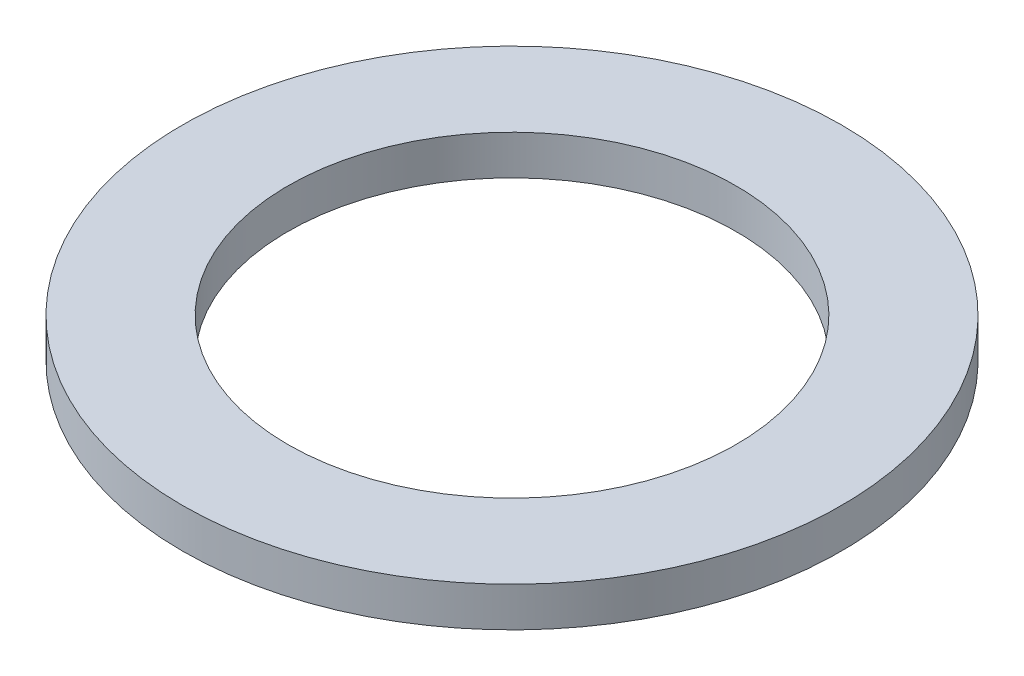
ISO-10303-21;
HEADER;
FILE_DESCRIPTION(('STEP AP214'),'2;1');
FILE_NAME('part.step','',(''),(''),'','','');
FILE_SCHEMA(('AUTOMOTIVE_DESIGN { 1 0 10303 214 1 1 1 1 }'));
ENDSEC;
DATA;
#1=APPLICATION_CONTEXT('core data for automotive mechanical design processes');
#2=APPLICATION_PROTOCOL_DEFINITION('international standard','automotive_design',2000,#1);
#3=PRODUCT_CONTEXT('',#1,'mechanical');
#4=PRODUCT('Part','Part','',(#3));
#5=PRODUCT_RELATED_PRODUCT_CATEGORY('part','',(#4));
#6=PRODUCT_DEFINITION_FORMATION('','',#4);
#7=PRODUCT_DEFINITION_CONTEXT('part definition',#1,'design');
#8=PRODUCT_DEFINITION('design','',#6,#7);
#9=PRODUCT_DEFINITION_SHAPE('','',#8);
#10=(LENGTH_UNIT() NAMED_UNIT(*) SI_UNIT(.MILLI.,.METRE.));
#11=(NAMED_UNIT(*) PLANE_ANGLE_UNIT() SI_UNIT($,.RADIAN.));
#12=(NAMED_UNIT(*) SI_UNIT($,.STERADIAN.) SOLID_ANGLE_UNIT());
#13=UNCERTAINTY_MEASURE_WITH_UNIT(LENGTH_MEASURE(1.E-05),#10,'distance_accuracy_value','');
#14=(GEOMETRIC_REPRESENTATION_CONTEXT(3) GLOBAL_UNCERTAINTY_ASSIGNED_CONTEXT((#13)) GLOBAL_UNIT_ASSIGNED_CONTEXT((#10,
#11,#12)) REPRESENTATION_CONTEXT('',''));
#15=CARTESIAN_POINT('',(0.,0.,0.));
#16=DIRECTION('',(0.,0.,1.));
#17=DIRECTION('',(1.,0.,0.));
#18=AXIS2_PLACEMENT_3D('',#15,#16,#17);
#19=CARTESIAN_POINT('',(0.,0.,0.));
#20=DIRECTION('',(0.,1.,0.));
#21=DIRECTION('',(0.,0.,1.));
#22=AXIS2_PLACEMENT_3D('',#19,#20,#21);
#23=CYLINDRICAL_SURFACE('',#22,17.);
#24=CARTESIAN_POINT('',(0.,-3.,0.));
#25=DIRECTION('',(0.,1.,0.));
#26=DIRECTION('',(0.,0.,1.));
#27=AXIS2_PLACEMENT_3D('',#24,#25,#26);
#28=CIRCLE('',#27,17.);
#29=CARTESIAN_POINT('',(0.,-3.,17.));
#30=VERTEX_POINT('',#29);
#31=EDGE_CURVE('E53',#30,#30,#28,.T.);
#32=ORIENTED_EDGE('',*,*,#31,.F.);
#33=EDGE_LOOP('',(#32));
#34=FACE_BOUND('',#33,.T.);
#35=CARTESIAN_POINT('',(0.,0.,0.));
#36=DIRECTION('',(0.,1.,0.));
#37=DIRECTION('',(0.,0.,1.));
#38=AXIS2_PLACEMENT_3D('',#35,#36,#37);
#39=CIRCLE('',#38,17.);
#40=CARTESIAN_POINT('',(0.,0.,17.));
#41=VERTEX_POINT('',#40);
#42=EDGE_CURVE('E10',#41,#41,#39,.T.);
#43=ORIENTED_EDGE('',*,*,#42,.T.);
#44=EDGE_LOOP('',(#43));
#45=FACE_BOUND('',#44,.T.);
#46=ADVANCED_FACE('F35',(#34,#45),#23,.F.);
#47=CARTESIAN_POINT('',(17.,0.,0.));
#48=DIRECTION('',(0.,-1.,0.));
#49=DIRECTION('',(0.,0.,-1.));
#50=AXIS2_PLACEMENT_3D('',#47,#48,#49);
#51=PLANE('',#50);
#52=ORIENTED_EDGE('',*,*,#42,.F.);
#53=EDGE_LOOP('',(#52));
#54=FACE_BOUND('',#53,.T.);
#55=CARTESIAN_POINT('',(0.,0.,0.));
#56=DIRECTION('',(0.,1.,0.));
#57=DIRECTION('',(0.,0.,1.));
#58=AXIS2_PLACEMENT_3D('',#55,#56,#57);
#59=CIRCLE('',#58,25.);
#60=CARTESIAN_POINT('',(0.,0.,25.));
#61=VERTEX_POINT('',#60);
#62=EDGE_CURVE('E42',#61,#61,#59,.T.);
#63=ORIENTED_EDGE('',*,*,#62,.T.);
#64=EDGE_LOOP('',(#63));
#65=FACE_BOUND('',#64,.T.);
#66=ADVANCED_FACE('F62',(#54,#65),#51,.F.);
#67=CARTESIAN_POINT('',(0.,0.,0.));
#68=DIRECTION('',(0.,1.,0.));
#69=DIRECTION('',(0.,0.,1.));
#70=AXIS2_PLACEMENT_3D('',#67,#68,#69);
#71=CYLINDRICAL_SURFACE('',#70,25.);
#72=ORIENTED_EDGE('',*,*,#62,.F.);
#73=EDGE_LOOP('',(#72));
#74=FACE_BOUND('',#73,.T.);
#75=CARTESIAN_POINT('',(0.,-3.,0.));
#76=DIRECTION('',(0.,1.,0.));
#77=DIRECTION('',(0.,0.,1.));
#78=AXIS2_PLACEMENT_3D('',#75,#76,#77);
#79=CIRCLE('',#78,25.);
#80=CARTESIAN_POINT('',(0.,-3.,25.));
#81=VERTEX_POINT('',#80);
#82=EDGE_CURVE('E48',#81,#81,#79,.T.);
#83=ORIENTED_EDGE('',*,*,#82,.T.);
#84=EDGE_LOOP('',(#83));
#85=FACE_BOUND('',#84,.T.);
#86=ADVANCED_FACE('F66',(#74,#85),#71,.T.);
#87=CARTESIAN_POINT('',(25.,-3.,0.));
#88=DIRECTION('',(0.,1.,0.));
#89=DIRECTION('',(0.,0.,1.));
#90=AXIS2_PLACEMENT_3D('',#87,#88,#89);
#91=PLANE('',#90);
#92=ORIENTED_EDGE('',*,*,#82,.F.);
#93=EDGE_LOOP('',(#92));
#94=FACE_BOUND('',#93,.T.);
#95=ORIENTED_EDGE('',*,*,#31,.T.);
#96=EDGE_LOOP('',(#95));
#97=FACE_BOUND('',#96,.T.);
#98=ADVANCED_FACE('F59',(#94,#97),#91,.F.);
#99=CLOSED_SHELL('',(#46,#66,#86,#98));
#100=MANIFOLD_SOLID_BREP('B2',#99);
#101=ADVANCED_BREP_SHAPE_REPRESENTATION('',(#18,#100),#14);
#102=SHAPE_DEFINITION_REPRESENTATION(#9,#101);
ENDSEC;
END-ISO-10303-21;
